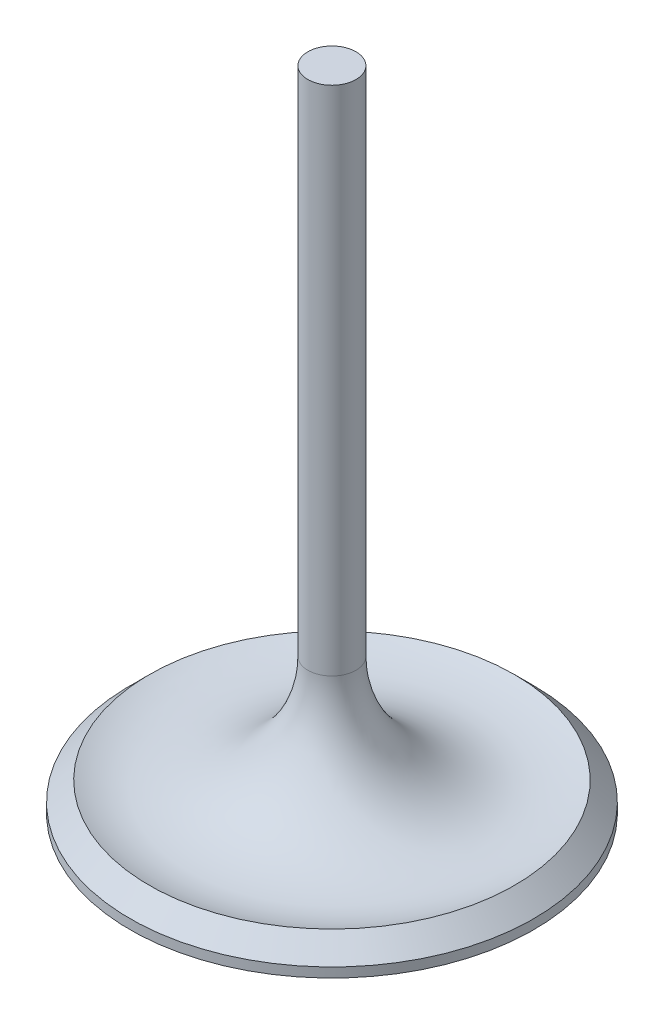
ISO-10303-21;
HEADER;
FILE_DESCRIPTION(('STEP AP214'),'2;1');
FILE_NAME('part.step','',(''),(''),'','','');
FILE_SCHEMA(('AUTOMOTIVE_DESIGN { 1 0 10303 214 1 1 1 1 }'));
ENDSEC;
DATA;
#1=APPLICATION_CONTEXT('core data for automotive mechanical design processes');
#2=APPLICATION_PROTOCOL_DEFINITION('international standard','automotive_design',2000,#1);
#3=PRODUCT_CONTEXT('',#1,'mechanical');
#4=PRODUCT('Part','Part','',(#3));
#5=PRODUCT_RELATED_PRODUCT_CATEGORY('part','',(#4));
#6=PRODUCT_DEFINITION_FORMATION('','',#4);
#7=PRODUCT_DEFINITION_CONTEXT('part definition',#1,'design');
#8=PRODUCT_DEFINITION('design','',#6,#7);
#9=PRODUCT_DEFINITION_SHAPE('','',#8);
#10=(LENGTH_UNIT() NAMED_UNIT(*) SI_UNIT(.MILLI.,.METRE.));
#11=(NAMED_UNIT(*) PLANE_ANGLE_UNIT() SI_UNIT($,.RADIAN.));
#12=(NAMED_UNIT(*) SI_UNIT($,.STERADIAN.) SOLID_ANGLE_UNIT());
#13=UNCERTAINTY_MEASURE_WITH_UNIT(LENGTH_MEASURE(1.E-05),#10,'distance_accuracy_value','');
#14=(GEOMETRIC_REPRESENTATION_CONTEXT(3) GLOBAL_UNCERTAINTY_ASSIGNED_CONTEXT((#13)) GLOBAL_UNIT_ASSIGNED_CONTEXT((#10,
#11,#12)) REPRESENTATION_CONTEXT('',''));
#15=CARTESIAN_POINT('',(0.,0.,0.));
#16=DIRECTION('',(0.,0.,1.));
#17=DIRECTION('',(1.,0.,0.));
#18=AXIS2_PLACEMENT_3D('',#15,#16,#17);
#19=CARTESIAN_POINT('',(26.67,0.,0.));
#20=DIRECTION('',(0.,-1.,0.));
#21=DIRECTION('',(0.,0.,-1.));
#22=AXIS2_PLACEMENT_3D('',#19,#20,#21);
#23=PLANE('',#22);
#24=CARTESIAN_POINT('',(0.,0.,0.));
#25=DIRECTION('',(0.,-1.,0.));
#26=DIRECTION('',(0.,0.,-1.));
#27=AXIS2_PLACEMENT_3D('',#24,#25,#26);
#28=CIRCLE('',#27,26.67);
#29=CARTESIAN_POINT('',(0.,0.,-26.67));
#30=VERTEX_POINT('',#29);
#31=EDGE_CURVE('E10',#30,#30,#28,.T.);
#32=ORIENTED_EDGE('',*,*,#31,.T.);
#33=EDGE_LOOP('',(#32));
#34=FACE_BOUND('',#33,.T.);
#35=ADVANCED_FACE('F31',(#34),#23,.T.);
#36=CARTESIAN_POINT('',(0.,0.,0.));
#37=DIRECTION('',(0.,-1.,0.));
#38=DIRECTION('',(0.,0.,-1.));
#39=AXIS2_PLACEMENT_3D('',#36,#37,#38);
#40=CYLINDRICAL_SURFACE('',#39,26.67);
#41=CARTESIAN_POINT('',(0.,1.27,0.));
#42=DIRECTION('',(0.,-1.,0.));
#43=DIRECTION('',(0.,0.,-1.));
#44=AXIS2_PLACEMENT_3D('',#41,#42,#43);
#45=CIRCLE('',#44,26.67);
#46=CARTESIAN_POINT('',(0.,1.27,-26.67));
#47=VERTEX_POINT('',#46);
#48=EDGE_CURVE('E37',#47,#47,#45,.T.);
#49=ORIENTED_EDGE('',*,*,#48,.T.);
#50=EDGE_LOOP('',(#49));
#51=FACE_BOUND('',#50,.T.);
#52=ORIENTED_EDGE('',*,*,#31,.F.);
#53=EDGE_LOOP('',(#52));
#54=FACE_BOUND('',#53,.T.);
#55=ADVANCED_FACE('F66',(#51,#54),#40,.T.);
#56=CARTESIAN_POINT('',(0.,1.27,0.));
#57=DIRECTION('',(0.,-1.,0.));
#58=DIRECTION('',(0.,0.,-1.));
#59=AXIS2_PLACEMENT_3D('',#56,#57,#58);
#60=CONICAL_SURFACE('',#59,26.67,0.785398163397454);
#61=CARTESIAN_POINT('',(0.,3.81,0.));
#62=DIRECTION('',(0.,-1.,0.));
#63=DIRECTION('',(0.,0.,-1.));
#64=AXIS2_PLACEMENT_3D('',#61,#62,#63);
#65=CIRCLE('',#64,24.13);
#66=CARTESIAN_POINT('',(0.,3.81,-24.13));
#67=VERTEX_POINT('',#66);
#68=EDGE_CURVE('E41',#67,#67,#65,.T.);
#69=ORIENTED_EDGE('',*,*,#68,.T.);
#70=EDGE_LOOP('',(#69));
#71=FACE_BOUND('',#70,.T.);
#72=ORIENTED_EDGE('',*,*,#48,.F.);
#73=EDGE_LOOP('',(#72));
#74=FACE_BOUND('',#73,.T.);
#75=ADVANCED_FACE('F70',(#71,#74),#60,.T.);
#76=CARTESIAN_POINT('',(0.,17.9546986535592,0.));
#77=DIRECTION('',(0.,-1.,0.));
#78=DIRECTION('',(0.,0.,-1.));
#79=AXIS2_PLACEMENT_3D('',#76,#77,#78);
#80=TOROIDAL_SURFACE('',#79,18.43,15.25);
#81=CARTESIAN_POINT('',(0.,17.9546986535592,0.));
#82=DIRECTION('',(0.,-1.,0.));
#83=DIRECTION('',(0.,0.,-1.));
#84=AXIS2_PLACEMENT_3D('',#81,#82,#83);
#85=CIRCLE('',#84,3.18000000000001);
#86=CARTESIAN_POINT('',(0.,17.9546986535592,-3.18000000000001));
#87=VERTEX_POINT('',#86);
#88=EDGE_CURVE('E45',#87,#87,#85,.T.);
#89=ORIENTED_EDGE('',*,*,#88,.T.);
#90=EDGE_LOOP('',(#89));
#91=FACE_BOUND('',#90,.T.);
#92=ORIENTED_EDGE('',*,*,#68,.F.);
#93=EDGE_LOOP('',(#92));
#94=FACE_BOUND('',#93,.T.);
#95=ADVANCED_FACE('F63',(#91,#94),#80,.F.);
#96=CARTESIAN_POINT('',(0.,0.,0.));
#97=DIRECTION('',(0.,-1.,0.));
#98=DIRECTION('',(0.,0.,-1.));
#99=AXIS2_PLACEMENT_3D('',#96,#97,#98);
#100=CYLINDRICAL_SURFACE('',#99,3.18000000000001);
#101=CARTESIAN_POINT('',(0.,85.55,0.));
#102=DIRECTION('',(0.,-1.,0.));
#103=DIRECTION('',(0.,0.,-1.));
#104=AXIS2_PLACEMENT_3D('',#101,#102,#103);
#105=CIRCLE('',#104,3.18);
#106=CARTESIAN_POINT('',(0.,85.55,-3.18));
#107=VERTEX_POINT('',#106);
#108=EDGE_CURVE('E50',#107,#107,#105,.T.);
#109=ORIENTED_EDGE('',*,*,#108,.T.);
#110=EDGE_LOOP('',(#109));
#111=FACE_BOUND('',#110,.T.);
#112=ORIENTED_EDGE('',*,*,#88,.F.);
#113=EDGE_LOOP('',(#112));
#114=FACE_BOUND('',#113,.T.);
#115=ADVANCED_FACE('F54',(#111,#114),#100,.T.);
#116=CARTESIAN_POINT('',(0.,85.55,0.));
#117=DIRECTION('',(0.,1.,0.));
#118=DIRECTION('',(0.,0.,1.));
#119=AXIS2_PLACEMENT_3D('',#116,#117,#118);
#120=PLANE('',#119);
#121=ORIENTED_EDGE('',*,*,#108,.F.);
#122=EDGE_LOOP('',(#121));
#123=FACE_BOUND('',#122,.T.);
#124=ADVANCED_FACE('F57',(#123),#120,.T.);
#125=CLOSED_SHELL('',(#35,#55,#75,#95,#115,#124));
#126=MANIFOLD_SOLID_BREP('B2',#125);
#127=ADVANCED_BREP_SHAPE_REPRESENTATION('',(#18,#126),#14);
#128=SHAPE_DEFINITION_REPRESENTATION(#9,#127);
ENDSEC;
END-ISO-10303-21;
